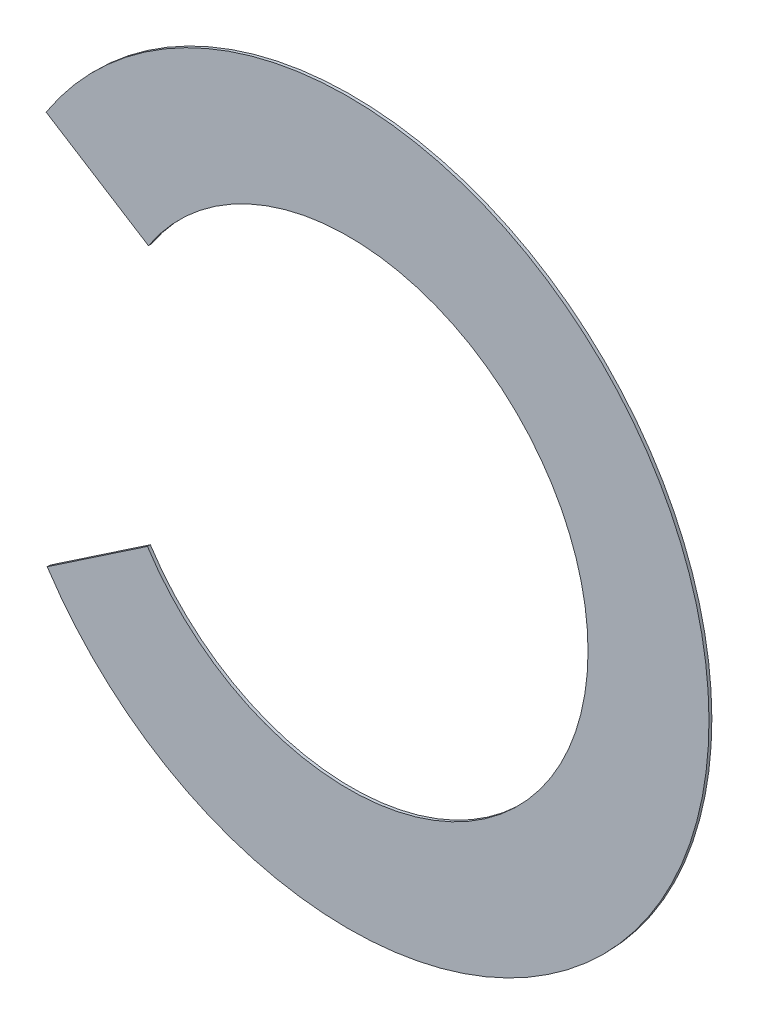
ISO-10303-21;
HEADER;
FILE_DESCRIPTION(('STEP AP214'),'2;1');
FILE_NAME('part.step','',(''),(''),'','','');
FILE_SCHEMA(('AUTOMOTIVE_DESIGN { 1 0 10303 214 1 1 1 1 }'));
ENDSEC;
DATA;
#1=APPLICATION_CONTEXT('core data for automotive mechanical design processes');
#2=APPLICATION_PROTOCOL_DEFINITION('international standard','automotive_design',2000,#1);
#3=PRODUCT_CONTEXT('',#1,'mechanical');
#4=PRODUCT('Part','Part','',(#3));
#5=PRODUCT_RELATED_PRODUCT_CATEGORY('part','',(#4));
#6=PRODUCT_DEFINITION_FORMATION('','',#4);
#7=PRODUCT_DEFINITION_CONTEXT('part definition',#1,'design');
#8=PRODUCT_DEFINITION('design','',#6,#7);
#9=PRODUCT_DEFINITION_SHAPE('','',#8);
#10=(LENGTH_UNIT() NAMED_UNIT(*) SI_UNIT(.MILLI.,.METRE.));
#11=(NAMED_UNIT(*) PLANE_ANGLE_UNIT() SI_UNIT($,.RADIAN.));
#12=(NAMED_UNIT(*) SI_UNIT($,.STERADIAN.) SOLID_ANGLE_UNIT());
#13=UNCERTAINTY_MEASURE_WITH_UNIT(LENGTH_MEASURE(1.E-05),#10,'distance_accuracy_value','');
#14=(GEOMETRIC_REPRESENTATION_CONTEXT(3) GLOBAL_UNCERTAINTY_ASSIGNED_CONTEXT((#13)) GLOBAL_UNIT_ASSIGNED_CONTEXT((#10,
#11,#12)) REPRESENTATION_CONTEXT('',''));
#15=CARTESIAN_POINT('',(0.,0.,0.));
#16=DIRECTION('',(0.,0.,1.));
#17=DIRECTION('',(1.,0.,0.));
#18=AXIS2_PLACEMENT_3D('',#15,#16,#17);
#19=CARTESIAN_POINT('',(2.158303955745,-23.62100672042,0.01));
#20=DIRECTION('',(0.,0.,1.));
#21=DIRECTION('',(1.,0.,0.));
#22=AXIS2_PLACEMENT_3D('',#19,#20,#21);
#23=PLANE('',#22);
#24=CARTESIAN_POINT('',(2.072186,-23.62111230097,0.01));
#25=DIRECTION('',(0.,0.,1.));
#26=DIRECTION('',(1.,0.,0.));
#27=AXIS2_PLACEMENT_3D('',#24,#25,#26);
#28=CIRCLE('',#27,0.833212);
#29=CARTESIAN_POINT('',(1.371812054388,-24.07246424043,0.01));
#30=VERTEX_POINT('',#29);
#31=CARTESIAN_POINT('',(1.375358893939,-23.16430356506,0.01));
#32=VERTEX_POINT('',#31);
#33=EDGE_CURVE('E91',#30,#32,#28,.T.);
#34=ORIENTED_EDGE('',*,*,#33,.F.);
#35=DIRECTION('',(-0.828472143966945,-0.560030272994963,0.));
#36=VECTOR('',#35,1.);
#37=CARTESIAN_POINT('',(1.371812054388,-24.07246424043,0.01));
#38=LINE('',#37,#36);
#39=CARTESIAN_POINT('',(1.022985,-24.30826421502,0.01));
#40=VERTEX_POINT('',#39);
#41=EDGE_CURVE('E11',#30,#40,#38,.T.);
#42=ORIENTED_EDGE('',*,*,#41,.T.);
#43=CARTESIAN_POINT('',(2.072186,-23.62111230097,0.01));
#44=DIRECTION('',(0.,0.,1.));
#45=DIRECTION('',(1.,0.,0.));
#46=AXIS2_PLACEMENT_3D('',#43,#44,#45);
#47=CIRCLE('',#46,1.254193163505);
#48=CARTESIAN_POINT('',(1.019202865576,-22.93977023563,0.01));
#49=VERTEX_POINT('',#48);
#50=EDGE_CURVE('E77',#40,#49,#47,.T.);
#51=ORIENTED_EDGE('',*,*,#50,.T.);
#52=DIRECTION('',(-0.845925408529117,0.533301231205073,0.));
#53=VECTOR('',#52,1.);
#54=CARTESIAN_POINT('',(1.375358893939,-23.16430356506,0.01));
#55=LINE('',#54,#53);
#56=EDGE_CURVE('E87',#32,#49,#55,.T.);
#57=ORIENTED_EDGE('',*,*,#56,.F.);
#58=EDGE_LOOP('',(#34,#42,#51,#57));
#59=FACE_BOUND('',#58,.T.);
#60=ADVANCED_FACE('F17',(#59),#23,.T.);
#61=CARTESIAN_POINT('',(2.158303955745,-23.62100672042,0.));
#62=DIRECTION('',(0.,0.,1.));
#63=DIRECTION('',(1.,0.,0.));
#64=AXIS2_PLACEMENT_3D('',#61,#62,#63);
#65=PLANE('',#64);
#66=CARTESIAN_POINT('',(2.072186,-23.62111230097,0.));
#67=DIRECTION('',(0.,0.,1.));
#68=DIRECTION('',(1.,0.,0.));
#69=AXIS2_PLACEMENT_3D('',#66,#67,#68);
#70=CIRCLE('',#69,0.833212);
#71=CARTESIAN_POINT('',(1.371812054388,-24.07246424043,0.));
#72=VERTEX_POINT('',#71);
#73=CARTESIAN_POINT('',(1.375358893939,-23.16430356506,0.));
#74=VERTEX_POINT('',#73);
#75=EDGE_CURVE('E72',#72,#74,#70,.T.);
#76=ORIENTED_EDGE('',*,*,#75,.T.);
#77=DIRECTION('',(-0.845925408529117,0.533301231205073,0.));
#78=VECTOR('',#77,1.);
#79=CARTESIAN_POINT('',(1.375358893939,-23.16430356506,0.));
#80=LINE('',#79,#78);
#81=CARTESIAN_POINT('',(1.019202865576,-22.93977023563,0.));
#82=VERTEX_POINT('',#81);
#83=EDGE_CURVE('E103',#74,#82,#80,.T.);
#84=ORIENTED_EDGE('',*,*,#83,.T.);
#85=CARTESIAN_POINT('',(2.072186,-23.62111230097,0.));
#86=DIRECTION('',(0.,0.,1.));
#87=DIRECTION('',(1.,0.,0.));
#88=AXIS2_PLACEMENT_3D('',#85,#86,#87);
#89=CIRCLE('',#88,1.254193163505);
#90=CARTESIAN_POINT('',(1.022985,-24.30826421502,0.));
#91=VERTEX_POINT('',#90);
#92=EDGE_CURVE('E74',#91,#82,#89,.T.);
#93=ORIENTED_EDGE('',*,*,#92,.F.);
#94=DIRECTION('',(-0.828472143966945,-0.560030272994963,0.));
#95=VECTOR('',#94,1.);
#96=CARTESIAN_POINT('',(1.371812054388,-24.07246424043,0.));
#97=LINE('',#96,#95);
#98=EDGE_CURVE('E25',#72,#91,#97,.T.);
#99=ORIENTED_EDGE('',*,*,#98,.F.);
#100=EDGE_LOOP('',(#76,#84,#93,#99));
#101=FACE_BOUND('',#100,.T.);
#102=ADVANCED_FACE('F70',(#101),#65,.F.);
#103=CARTESIAN_POINT('',(1.371812054388,-24.07246424043,0.));
#104=DIRECTION('',(0.560030272994963,-0.828472143966945,0.));
#105=DIRECTION('',(0.,0.,-1.));
#106=AXIS2_PLACEMENT_3D('',#103,#104,#105);
#107=PLANE('',#106);
#108=DIRECTION('',(0.,0.,1.));
#109=VECTOR('',#108,1.);
#110=CARTESIAN_POINT('',(1.371812054388,-24.07246424043,0.));
#111=LINE('',#110,#109);
#112=EDGE_CURVE('E83',#72,#30,#111,.T.);
#113=ORIENTED_EDGE('',*,*,#112,.F.);
#114=ORIENTED_EDGE('',*,*,#98,.T.);
#115=DIRECTION('',(0.,0.,1.));
#116=VECTOR('',#115,1.);
#117=CARTESIAN_POINT('',(1.022985,-24.30826421502,0.));
#118=LINE('',#117,#116);
#119=EDGE_CURVE('E106',#91,#40,#118,.T.);
#120=ORIENTED_EDGE('',*,*,#119,.T.);
#121=ORIENTED_EDGE('',*,*,#41,.F.);
#122=EDGE_LOOP('',(#113,#114,#120,#121));
#123=FACE_BOUND('',#122,.T.);
#124=ADVANCED_FACE('F89',(#123),#107,.F.);
#125=CARTESIAN_POINT('',(2.072186,-23.62111230097,0.));
#126=DIRECTION('',(0.,0.,-1.));
#127=DIRECTION('',(1.,0.,0.));
#128=AXIS2_PLACEMENT_3D('',#125,#126,#127);
#129=CYLINDRICAL_SURFACE('',#128,1.254193163505);
#130=ORIENTED_EDGE('',*,*,#119,.F.);
#131=ORIENTED_EDGE('',*,*,#92,.T.);
#132=DIRECTION('',(0.,0.,1.));
#133=VECTOR('',#132,1.);
#134=CARTESIAN_POINT('',(1.019202865576,-22.93977023563,0.));
#135=LINE('',#134,#133);
#136=EDGE_CURVE('E102',#82,#49,#135,.T.);
#137=ORIENTED_EDGE('',*,*,#136,.T.);
#138=ORIENTED_EDGE('',*,*,#50,.F.);
#139=EDGE_LOOP('',(#130,#131,#137,#138));
#140=FACE_BOUND('',#139,.T.);
#141=ADVANCED_FACE('F117',(#140),#129,.T.);
#142=CARTESIAN_POINT('',(1.375358893939,-23.16430356506,0.));
#143=DIRECTION('',(-0.533301231205073,-0.845925408529117,0.));
#144=DIRECTION('',(-0.845925408529117,0.533301231205073,0.));
#145=AXIS2_PLACEMENT_3D('',#142,#143,#144);
#146=PLANE('',#145);
#147=DIRECTION('',(0.,0.,1.));
#148=VECTOR('',#147,1.);
#149=CARTESIAN_POINT('',(1.375358893939,-23.16430356506,0.));
#150=LINE('',#149,#148);
#151=EDGE_CURVE('E85',#74,#32,#150,.T.);
#152=ORIENTED_EDGE('',*,*,#151,.T.);
#153=ORIENTED_EDGE('',*,*,#56,.T.);
#154=ORIENTED_EDGE('',*,*,#136,.F.);
#155=ORIENTED_EDGE('',*,*,#83,.F.);
#156=EDGE_LOOP('',(#152,#153,#154,#155));
#157=FACE_BOUND('',#156,.T.);
#158=ADVANCED_FACE('F119',(#157),#146,.T.);
#159=CARTESIAN_POINT('',(2.072186,-23.62111230097,0.));
#160=DIRECTION('',(0.,0.,-1.));
#161=DIRECTION('',(1.,0.,0.));
#162=AXIS2_PLACEMENT_3D('',#159,#160,#161);
#163=CYLINDRICAL_SURFACE('',#162,0.833212);
#164=ORIENTED_EDGE('',*,*,#112,.T.);
#165=ORIENTED_EDGE('',*,*,#33,.T.);
#166=ORIENTED_EDGE('',*,*,#151,.F.);
#167=ORIENTED_EDGE('',*,*,#75,.F.);
#168=EDGE_LOOP('',(#164,#165,#166,#167));
#169=FACE_BOUND('',#168,.T.);
#170=ADVANCED_FACE('F81',(#169),#163,.F.);
#171=CLOSED_SHELL('',(#60,#102,#124,#141,#158,#170));
#172=MANIFOLD_SOLID_BREP('B1',#171);
#173=ADVANCED_BREP_SHAPE_REPRESENTATION('',(#18,#172),#14);
#174=SHAPE_DEFINITION_REPRESENTATION(#9,#173);
ENDSEC;
END-ISO-10303-21;
